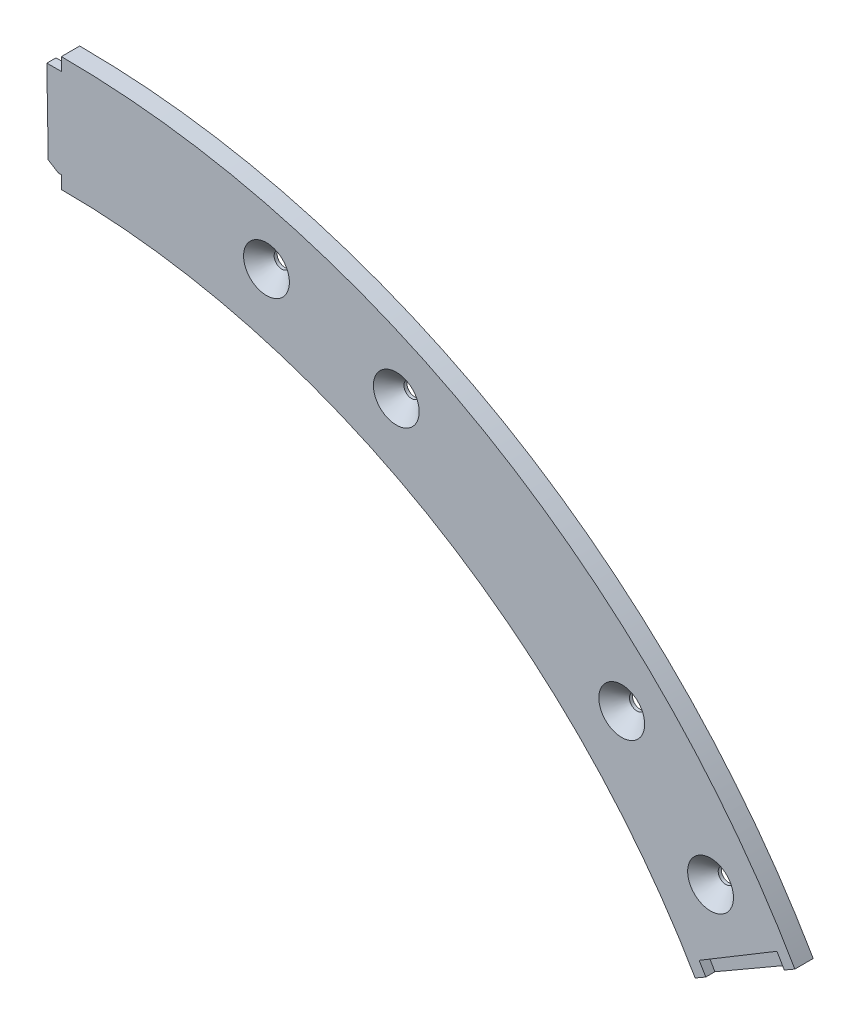
ISO-10303-21;
HEADER;
FILE_DESCRIPTION(('STEP AP214'),'2;1');
FILE_NAME('part.step','',(''),(''),'','','');
FILE_SCHEMA(('AUTOMOTIVE_DESIGN { 1 0 10303 214 1 1 1 1 }'));
ENDSEC;
DATA;
#1=APPLICATION_CONTEXT('core data for automotive mechanical design processes');
#2=APPLICATION_PROTOCOL_DEFINITION('international standard','automotive_design',2000,#1);
#3=PRODUCT_CONTEXT('',#1,'mechanical');
#4=PRODUCT('Part','Part','',(#3));
#5=PRODUCT_RELATED_PRODUCT_CATEGORY('part','',(#4));
#6=PRODUCT_DEFINITION_FORMATION('','',#4);
#7=PRODUCT_DEFINITION_CONTEXT('part definition',#1,'design');
#8=PRODUCT_DEFINITION('design','',#6,#7);
#9=PRODUCT_DEFINITION_SHAPE('','',#8);
#10=(LENGTH_UNIT() NAMED_UNIT(*) SI_UNIT(.MILLI.,.METRE.));
#11=(NAMED_UNIT(*) PLANE_ANGLE_UNIT() SI_UNIT($,.RADIAN.));
#12=(NAMED_UNIT(*) SI_UNIT($,.STERADIAN.) SOLID_ANGLE_UNIT());
#13=UNCERTAINTY_MEASURE_WITH_UNIT(LENGTH_MEASURE(1.E-05),#10,'distance_accuracy_value','');
#14=(GEOMETRIC_REPRESENTATION_CONTEXT(3) GLOBAL_UNCERTAINTY_ASSIGNED_CONTEXT((#13)) GLOBAL_UNIT_ASSIGNED_CONTEXT((#10,
#11,#12)) REPRESENTATION_CONTEXT('',''));
#15=CARTESIAN_POINT('',(0.,0.,0.));
#16=DIRECTION('',(0.,0.,1.));
#17=DIRECTION('',(1.,0.,0.));
#18=AXIS2_PLACEMENT_3D('',#15,#16,#17);
#19=CARTESIAN_POINT('',(0.,277.3,6.));
#20=DIRECTION('',(1.,0.,0.));
#21=DIRECTION('',(0.,0.,-1.));
#22=AXIS2_PLACEMENT_3D('',#19,#20,#21);
#23=PLANE('',#22);
#24=DIRECTION('',(0.,0.,1.));
#25=VECTOR('',#24,1.);
#26=CARTESIAN_POINT('',(0.,243.81,6.));
#27=LINE('',#26,#25);
#28=CARTESIAN_POINT('',(0.,243.81,3.));
#29=VERTEX_POINT('',#28);
#30=CARTESIAN_POINT('',(0.,243.81,6.));
#31=VERTEX_POINT('',#30);
#32=EDGE_CURVE('E162',#29,#31,#27,.T.);
#33=ORIENTED_EDGE('',*,*,#32,.F.);
#34=DIRECTION('',(0.,-1.,0.));
#35=VECTOR('',#34,1.);
#36=CARTESIAN_POINT('',(0.,273.1,3.));
#37=LINE('',#36,#35);
#38=CARTESIAN_POINT('',(0.,273.1,3.));
#39=VERTEX_POINT('',#38);
#40=EDGE_CURVE('E319',#39,#29,#37,.T.);
#41=ORIENTED_EDGE('',*,*,#40,.F.);
#42=DIRECTION('',(0.,0.,-1.));
#43=VECTOR('',#42,1.);
#44=CARTESIAN_POINT('',(0.,273.1,6.));
#45=LINE('',#44,#43);
#46=CARTESIAN_POINT('',(0.,273.1,6.));
#47=VERTEX_POINT('',#46);
#48=EDGE_CURVE('E323',#47,#39,#45,.T.);
#49=ORIENTED_EDGE('',*,*,#48,.F.);
#50=DIRECTION('',(0.,-1.,0.));
#51=VECTOR('',#50,1.);
#52=CARTESIAN_POINT('',(0.,277.3,6.));
#53=LINE('',#52,#51);
#54=CARTESIAN_POINT('',(0.,277.3,6.));
#55=VERTEX_POINT('',#54);
#56=EDGE_CURVE('E220',#55,#47,#53,.T.);
#57=ORIENTED_EDGE('',*,*,#56,.F.);
#58=DIRECTION('',(0.,0.,-1.));
#59=VECTOR('',#58,1.);
#60=CARTESIAN_POINT('',(0.,277.3,6.));
#61=LINE('',#60,#59);
#62=CARTESIAN_POINT('',(0.,277.3,0.));
#63=VERTEX_POINT('',#62);
#64=EDGE_CURVE('E212',#55,#63,#61,.T.);
#65=ORIENTED_EDGE('',*,*,#64,.T.);
#66=DIRECTION('',(0.,-1.,0.));
#67=VECTOR('',#66,1.);
#68=CARTESIAN_POINT('',(0.,277.3,0.));
#69=LINE('',#68,#67);
#70=CARTESIAN_POINT('',(0.,239.61,0.));
#71=VERTEX_POINT('',#70);
#72=EDGE_CURVE('E221',#63,#71,#69,.T.);
#73=ORIENTED_EDGE('',*,*,#72,.T.);
#74=DIRECTION('',(0.,0.,-1.));
#75=VECTOR('',#74,1.);
#76=CARTESIAN_POINT('',(0.,239.61,6.));
#77=LINE('',#76,#75);
#78=CARTESIAN_POINT('',(0.,239.61,6.));
#79=VERTEX_POINT('',#78);
#80=EDGE_CURVE('E216',#79,#71,#77,.T.);
#81=ORIENTED_EDGE('',*,*,#80,.F.);
#82=EDGE_CURVE('E239',#31,#79,#53,.T.);
#83=ORIENTED_EDGE('',*,*,#82,.F.);
#84=EDGE_LOOP('',(#33,#41,#49,#57,#65,#73,#81,#83));
#85=FACE_BOUND('',#84,.T.);
#86=ADVANCED_FACE('F47',(#85),#23,.F.);
#87=CARTESIAN_POINT('',(0.,0.,6.));
#88=DIRECTION('',(0.,0.,-1.));
#89=DIRECTION('',(-1.,0.,0.));
#90=AXIS2_PLACEMENT_3D('',#87,#88,#89);
#91=CYLINDRICAL_SURFACE('',#90,239.61);
#92=CARTESIAN_POINT('',(0.,0.,0.));
#93=DIRECTION('',(0.,0.,-1.));
#94=DIRECTION('',(-1.,0.,0.));
#95=AXIS2_PLACEMENT_3D('',#92,#93,#94);
#96=CIRCLE('',#95,239.61);
#97=CARTESIAN_POINT('',(207.508347000789,119.805,0.));
#98=VERTEX_POINT('',#97);
#99=EDGE_CURVE('E231',#71,#98,#96,.T.);
#100=ORIENTED_EDGE('',*,*,#99,.T.);
#101=DIRECTION('',(0.,0.,-1.));
#102=VECTOR('',#101,1.);
#103=CARTESIAN_POINT('',(207.508347000789,119.805,6.));
#104=LINE('',#103,#102);
#105=CARTESIAN_POINT('',(207.508347000789,119.805,6.));
#106=VERTEX_POINT('',#105);
#107=EDGE_CURVE('E204',#106,#98,#104,.T.);
#108=ORIENTED_EDGE('',*,*,#107,.F.);
#109=CARTESIAN_POINT('',(0.,0.,6.));
#110=DIRECTION('',(0.,0.,-1.));
#111=DIRECTION('',(-1.,0.,0.));
#112=AXIS2_PLACEMENT_3D('',#109,#110,#111);
#113=CIRCLE('',#112,239.61);
#114=EDGE_CURVE('E224',#79,#106,#113,.T.);
#115=ORIENTED_EDGE('',*,*,#114,.F.);
#116=ORIENTED_EDGE('',*,*,#80,.T.);
#117=EDGE_LOOP('',(#100,#108,#115,#116));
#118=FACE_BOUND('',#117,.T.);
#119=ADVANCED_FACE('F365',(#118),#91,.F.);
#120=CARTESIAN_POINT('',(240.148844469425,138.65,6.));
#121=DIRECTION('',(-0.499999999999999,0.866025403784439,0.));
#122=DIRECTION('',(-0.866025403784439,-0.499999999999999,0.));
#123=AXIS2_PLACEMENT_3D('',#120,#121,#122);
#124=PLANE('',#123);
#125=DIRECTION('',(0.866025403784439,0.499999999999999,0.));
#126=VECTOR('',#125,1.);
#127=CARTESIAN_POINT('',(210.972448615927,121.805,3.));
#128=LINE('',#127,#126);
#129=CARTESIAN_POINT('',(210.972448615927,121.805,3.));
#130=VERTEX_POINT('',#129);
#131=CARTESIAN_POINT('',(236.684742854287,136.65,3.));
#132=VERTEX_POINT('',#131);
#133=EDGE_CURVE('E168',#130,#132,#128,.T.);
#134=ORIENTED_EDGE('',*,*,#133,.F.);
#135=DIRECTION('',(0.,0.,-1.));
#136=VECTOR('',#135,1.);
#137=CARTESIAN_POINT('',(210.972448615927,121.805,6.));
#138=LINE('',#137,#136);
#139=CARTESIAN_POINT('',(210.972448615927,121.805,6.));
#140=VERTEX_POINT('',#139);
#141=EDGE_CURVE('E164',#140,#130,#138,.T.);
#142=ORIENTED_EDGE('',*,*,#141,.F.);
#143=DIRECTION('',(0.866025403784439,0.499999999999999,0.));
#144=VECTOR('',#143,1.);
#145=CARTESIAN_POINT('',(240.148844469425,138.65,6.));
#146=LINE('',#145,#144);
#147=EDGE_CURVE('E243',#106,#140,#146,.T.);
#148=ORIENTED_EDGE('',*,*,#147,.F.);
#149=ORIENTED_EDGE('',*,*,#107,.T.);
#150=DIRECTION('',(0.866025403784439,0.499999999999999,0.));
#151=VECTOR('',#150,1.);
#152=CARTESIAN_POINT('',(240.148844469425,138.65,0.));
#153=LINE('',#152,#151);
#154=CARTESIAN_POINT('',(240.148844469425,138.65,0.));
#155=VERTEX_POINT('',#154);
#156=EDGE_CURVE('E228',#98,#155,#153,.T.);
#157=ORIENTED_EDGE('',*,*,#156,.T.);
#158=DIRECTION('',(0.,0.,-1.));
#159=VECTOR('',#158,1.);
#160=CARTESIAN_POINT('',(240.148844469425,138.65,6.));
#161=LINE('',#160,#159);
#162=CARTESIAN_POINT('',(240.148844469425,138.65,6.));
#163=VERTEX_POINT('',#162);
#164=EDGE_CURVE('E208',#163,#155,#161,.T.);
#165=ORIENTED_EDGE('',*,*,#164,.F.);
#166=CARTESIAN_POINT('',(236.684742854287,136.65,6.));
#167=VERTEX_POINT('',#166);
#168=EDGE_CURVE('E247',#167,#163,#146,.T.);
#169=ORIENTED_EDGE('',*,*,#168,.F.);
#170=DIRECTION('',(0.,0.,1.));
#171=VECTOR('',#170,1.);
#172=CARTESIAN_POINT('',(236.684742854287,136.65,6.));
#173=LINE('',#172,#171);
#174=EDGE_CURVE('E294',#132,#167,#173,.T.);
#175=ORIENTED_EDGE('',*,*,#174,.F.);
#176=EDGE_LOOP('',(#134,#142,#148,#149,#157,#165,#169,#175));
#177=FACE_BOUND('',#176,.T.);
#178=ADVANCED_FACE('F355',(#177),#124,.F.);
#179=CARTESIAN_POINT('',(0.,0.,6.));
#180=DIRECTION('',(0.,0.,-1.));
#181=DIRECTION('',(-1.,0.,0.));
#182=AXIS2_PLACEMENT_3D('',#179,#180,#181);
#183=CYLINDRICAL_SURFACE('',#182,277.3);
#184=CARTESIAN_POINT('',(0.,0.,0.));
#185=DIRECTION('',(0.,0.,1.));
#186=DIRECTION('',(-1.,0.,0.));
#187=AXIS2_PLACEMENT_3D('',#184,#185,#186);
#188=CIRCLE('',#187,277.3);
#189=EDGE_CURVE('E225',#155,#63,#188,.T.);
#190=ORIENTED_EDGE('',*,*,#189,.T.);
#191=ORIENTED_EDGE('',*,*,#64,.F.);
#192=CARTESIAN_POINT('',(0.,0.,6.));
#193=DIRECTION('',(0.,0.,1.));
#194=DIRECTION('',(-1.,0.,0.));
#195=AXIS2_PLACEMENT_3D('',#192,#193,#194);
#196=CIRCLE('',#195,277.3);
#197=EDGE_CURVE('E240',#163,#55,#196,.T.);
#198=ORIENTED_EDGE('',*,*,#197,.F.);
#199=ORIENTED_EDGE('',*,*,#164,.T.);
#200=EDGE_LOOP('',(#190,#191,#198,#199));
#201=FACE_BOUND('',#200,.T.);
#202=ADVANCED_FACE('F358',(#201),#183,.T.);
#203=CARTESIAN_POINT('',(0.,0.,6.));
#204=DIRECTION('',(0.,0.,-1.));
#205=DIRECTION('',(-1.,0.,0.));
#206=AXIS2_PLACEMENT_3D('',#203,#204,#205);
#207=PLANE('',#206);
#208=DIRECTION('',(-0.0174524064372835,0.999847695156391,0.));
#209=VECTOR('',#208,1.);
#210=CARTESIAN_POINT('',(-4.76625219802214,273.05840554721,6.));
#211=LINE('',#210,#209);
#212=CARTESIAN_POINT('',(-4.29145190841646,245.857115173428,6.));
#213=VERTEX_POINT('',#212);
#214=CARTESIAN_POINT('',(-4.76625219802214,273.05840554721,6.));
#215=VERTEX_POINT('',#214);
#216=EDGE_CURVE('E158',#213,#215,#211,.T.);
#217=ORIENTED_EDGE('',*,*,#216,.F.);
#218=DIRECTION('',(-0.850321567496518,0.526263462393376,0.));
#219=VECTOR('',#218,1.);
#220=CARTESIAN_POINT('',(-4.29145190841646,245.857115173428,6.));
#221=LINE('',#220,#219);
#222=CARTESIAN_POINT('',(-0.980595058735524,243.808028032981,6.));
#223=VERTEX_POINT('',#222);
#224=EDGE_CURVE('E66',#223,#213,#221,.T.);
#225=ORIENTED_EDGE('',*,*,#224,.F.);
#226=CARTESIAN_POINT('',(0.,0.,6.));
#227=DIRECTION('',(0.,0.,-1.));
#228=DIRECTION('',(-1.,0.,0.));
#229=AXIS2_PLACEMENT_3D('',#226,#227,#228);
#230=CIRCLE('',#229,243.81);
#231=EDGE_CURVE('E155',#223,#31,#230,.T.);
#232=ORIENTED_EDGE('',*,*,#231,.T.);
#233=ORIENTED_EDGE('',*,*,#82,.T.);
#234=ORIENTED_EDGE('',*,*,#114,.T.);
#235=ORIENTED_EDGE('',*,*,#147,.T.);
#236=CARTESIAN_POINT('',(0.,0.,6.));
#237=DIRECTION('',(0.,0.,-1.));
#238=DIRECTION('',(-1.,0.,0.));
#239=AXIS2_PLACEMENT_3D('',#236,#237,#238);
#240=CIRCLE('',#239,243.61);
#241=CARTESIAN_POINT('',(208.814526124042,125.468425428838,6.));
#242=VERTEX_POINT('',#241);
#243=EDGE_CURVE('E276',#242,#140,#240,.T.);
#244=ORIENTED_EDGE('',*,*,#243,.F.);
#245=DIRECTION('',(-0.857167300702113,-0.515038074910053,0.));
#246=VECTOR('',#245,1.);
#247=CARTESIAN_POINT('',(208.814526124042,125.468425428838,6.));
#248=LINE('',#247,#246);
#249=CARTESIAN_POINT('',(234.263823281887,140.759905872917,6.));
#250=VERTEX_POINT('',#249);
#251=EDGE_CURVE('E279',#250,#242,#248,.T.);
#252=ORIENTED_EDGE('',*,*,#251,.F.);
#253=CARTESIAN_POINT('',(0.,0.,6.));
#254=DIRECTION('',(0.,0.,-1.));
#255=DIRECTION('',(-1.,0.,0.));
#256=AXIS2_PLACEMENT_3D('',#253,#254,#255);
#257=CIRCLE('',#256,273.3);
#258=EDGE_CURVE('E272',#250,#167,#257,.T.);
#259=ORIENTED_EDGE('',*,*,#258,.T.);
#260=ORIENTED_EDGE('',*,*,#168,.T.);
#261=ORIENTED_EDGE('',*,*,#197,.T.);
#262=ORIENTED_EDGE('',*,*,#56,.T.);
#263=CARTESIAN_POINT('',(0.,0.,6.));
#264=DIRECTION('',(0.,0.,-1.));
#265=DIRECTION('',(-1.,0.,0.));
#266=AXIS2_PLACEMENT_3D('',#263,#264,#265);
#267=CIRCLE('',#266,273.1);
#268=EDGE_CURVE('E303',#215,#47,#267,.T.);
#269=ORIENTED_EDGE('',*,*,#268,.F.);
#270=EDGE_LOOP('',(#217,#225,#232,#233,#234,#235,#244,#252,#259,#260,#261,#262,#269));
#271=FACE_BOUND('',#270,.T.);
#272=CARTESIAN_POINT('',(183.472996514473,183.472996514474,6.));
#273=DIRECTION('',(0.,0.,-1.));
#274=DIRECTION('',(-1.,0.,0.));
#275=AXIS2_PLACEMENT_3D('',#272,#273,#274);
#276=CIRCLE('',#275,7.50000000000003);
#277=CARTESIAN_POINT('',(190.972996514473,183.472996514474,6.));
#278=VERTEX_POINT('',#277);
#279=EDGE_CURVE('E184',#278,#278,#276,.T.);
#280=ORIENTED_EDGE('',*,*,#279,.T.);
#281=EDGE_LOOP('',(#280));
#282=FACE_BOUND('',#281,.T.);
#283=CARTESIAN_POINT('',(212.545380931665,148.825877940006,6.));
#284=DIRECTION('',(0.,0.,-1.));
#285=DIRECTION('',(-1.,0.,0.));
#286=AXIS2_PLACEMENT_3D('',#283,#284,#285);
#287=CIRCLE('',#286,7.50000000000003);
#288=CARTESIAN_POINT('',(220.045380931665,148.825877940006,6.));
#289=VERTEX_POINT('',#288);
#290=EDGE_CURVE('E188',#289,#289,#287,.T.);
#291=ORIENTED_EDGE('',*,*,#290,.T.);
#292=EDGE_LOOP('',(#291));
#293=FACE_BOUND('',#292,.T.);
#294=CARTESIAN_POINT('',(109.656760373859,235.1596815024,6.));
#295=DIRECTION('',(0.,0.,-1.));
#296=DIRECTION('',(-1.,0.,0.));
#297=AXIS2_PLACEMENT_3D('',#294,#295,#296);
#298=CIRCLE('',#297,7.49999999999934);
#299=CARTESIAN_POINT('',(117.156760373858,235.1596815024,6.));
#300=VERTEX_POINT('',#299);
#301=EDGE_CURVE('E192',#300,#300,#298,.T.);
#302=ORIENTED_EDGE('',*,*,#301,.T.);
#303=EDGE_LOOP('',(#302));
#304=FACE_BOUND('',#303,.T.);
#305=CARTESIAN_POINT('',(67.1557776327521,250.628774147224,6.));
#306=DIRECTION('',(0.,0.,-1.));
#307=DIRECTION('',(-1.,0.,0.));
#308=AXIS2_PLACEMENT_3D('',#305,#306,#307);
#309=CIRCLE('',#308,7.49999999999931);
#310=CARTESIAN_POINT('',(74.6557776327514,250.628774147224,6.));
#311=VERTEX_POINT('',#310);
#312=EDGE_CURVE('E196',#311,#311,#309,.T.);
#313=ORIENTED_EDGE('',*,*,#312,.T.);
#314=EDGE_LOOP('',(#313));
#315=FACE_BOUND('',#314,.T.);
#316=ADVANCED_FACE('F153',(#271,#282,#293,#304,#315),#207,.F.);
#317=CARTESIAN_POINT('',(0.,0.,0.));
#318=DIRECTION('',(0.,0.,-1.));
#319=DIRECTION('',(-1.,0.,0.));
#320=AXIS2_PLACEMENT_3D('',#317,#318,#319);
#321=PLANE('',#320);
#322=CARTESIAN_POINT('',(67.1557776327521,250.628774147224,0.));
#323=DIRECTION('',(0.,0.,1.));
#324=DIRECTION('',(1.,0.,0.));
#325=AXIS2_PLACEMENT_3D('',#322,#323,#324);
#326=CIRCLE('',#325,2.49999999999925);
#327=CARTESIAN_POINT('',(69.6557776327514,250.628774147224,0.));
#328=VERTEX_POINT('',#327);
#329=EDGE_CURVE('E235',#328,#328,#326,.T.);
#330=ORIENTED_EDGE('',*,*,#329,.T.);
#331=EDGE_LOOP('',(#330));
#332=FACE_BOUND('',#331,.T.);
#333=CARTESIAN_POINT('',(109.656760373859,235.1596815024,0.));
#334=DIRECTION('',(0.,0.,1.));
#335=DIRECTION('',(1.,0.,0.));
#336=AXIS2_PLACEMENT_3D('',#333,#334,#335);
#337=CIRCLE('',#336,2.49999999999931);
#338=CARTESIAN_POINT('',(112.156760373858,235.1596815024,0.));
#339=VERTEX_POINT('',#338);
#340=EDGE_CURVE('E260',#339,#339,#337,.T.);
#341=ORIENTED_EDGE('',*,*,#340,.T.);
#342=EDGE_LOOP('',(#341));
#343=FACE_BOUND('',#342,.T.);
#344=CARTESIAN_POINT('',(183.472996514473,183.472996514474,0.));
#345=DIRECTION('',(0.,0.,1.));
#346=DIRECTION('',(1.,0.,0.));
#347=AXIS2_PLACEMENT_3D('',#344,#345,#346);
#348=CIRCLE('',#347,2.5);
#349=CARTESIAN_POINT('',(185.972996514473,183.472996514474,0.));
#350=VERTEX_POINT('',#349);
#351=EDGE_CURVE('E255',#350,#350,#348,.T.);
#352=ORIENTED_EDGE('',*,*,#351,.T.);
#353=EDGE_LOOP('',(#352));
#354=FACE_BOUND('',#353,.T.);
#355=CARTESIAN_POINT('',(212.545380931665,148.825877940006,0.));
#356=DIRECTION('',(0.,0.,1.));
#357=DIRECTION('',(1.,0.,0.));
#358=AXIS2_PLACEMENT_3D('',#355,#356,#357);
#359=CIRCLE('',#358,2.5);
#360=CARTESIAN_POINT('',(215.045380931665,148.825877940006,0.));
#361=VERTEX_POINT('',#360);
#362=EDGE_CURVE('E251',#361,#361,#359,.T.);
#363=ORIENTED_EDGE('',*,*,#362,.T.);
#364=EDGE_LOOP('',(#363));
#365=FACE_BOUND('',#364,.T.);
#366=ORIENTED_EDGE('',*,*,#99,.F.);
#367=ORIENTED_EDGE('',*,*,#72,.F.);
#368=ORIENTED_EDGE('',*,*,#189,.F.);
#369=ORIENTED_EDGE('',*,*,#156,.F.);
#370=EDGE_LOOP('',(#366,#367,#368,#369));
#371=FACE_BOUND('',#370,.T.);
#372=ADVANCED_FACE('F362',(#332,#343,#354,#365,#371),#321,.T.);
#373=CARTESIAN_POINT('',(212.545380931665,148.825877940006,0.));
#374=DIRECTION('',(0.,0.,1.));
#375=DIRECTION('',(1.,0.,0.));
#376=AXIS2_PLACEMENT_3D('',#373,#374,#375);
#377=CYLINDRICAL_SURFACE('',#376,2.5);
#378=CARTESIAN_POINT('',(212.545380931665,148.825877940006,0.99999999999998));
#379=DIRECTION('',(0.,0.,-1.));
#380=DIRECTION('',(-1.,0.,0.));
#381=AXIS2_PLACEMENT_3D('',#378,#379,#380);
#382=CIRCLE('',#381,2.5);
#383=CARTESIAN_POINT('',(215.045380931665,148.825877940006,0.99999999999998));
#384=VERTEX_POINT('',#383);
#385=EDGE_CURVE('E180',#384,#384,#382,.F.);
#386=ORIENTED_EDGE('',*,*,#385,.T.);
#387=EDGE_LOOP('',(#386));
#388=FACE_BOUND('',#387,.T.);
#389=ORIENTED_EDGE('',*,*,#362,.F.);
#390=EDGE_LOOP('',(#389));
#391=FACE_BOUND('',#390,.T.);
#392=ADVANCED_FACE('F439',(#388,#391),#377,.F.);
#393=CARTESIAN_POINT('',(183.472996514473,183.472996514474,0.));
#394=DIRECTION('',(0.,0.,1.));
#395=DIRECTION('',(1.,0.,0.));
#396=AXIS2_PLACEMENT_3D('',#393,#394,#395);
#397=CYLINDRICAL_SURFACE('',#396,2.5);
#398=CARTESIAN_POINT('',(183.472996514473,183.472996514474,0.99999999999998));
#399=DIRECTION('',(0.,0.,-1.));
#400=DIRECTION('',(-1.,0.,0.));
#401=AXIS2_PLACEMENT_3D('',#398,#399,#400);
#402=CIRCLE('',#401,2.5);
#403=CARTESIAN_POINT('',(185.972996514473,183.472996514474,0.99999999999998));
#404=VERTEX_POINT('',#403);
#405=EDGE_CURVE('E200',#404,#404,#402,.F.);
#406=ORIENTED_EDGE('',*,*,#405,.T.);
#407=EDGE_LOOP('',(#406));
#408=FACE_BOUND('',#407,.T.);
#409=ORIENTED_EDGE('',*,*,#351,.F.);
#410=EDGE_LOOP('',(#409));
#411=FACE_BOUND('',#410,.T.);
#412=ADVANCED_FACE('F433',(#408,#411),#397,.F.);
#413=CARTESIAN_POINT('',(109.656760373859,235.1596815024,0.));
#414=DIRECTION('',(0.,0.,1.));
#415=DIRECTION('',(1.,0.,0.));
#416=AXIS2_PLACEMENT_3D('',#413,#414,#415);
#417=CYLINDRICAL_SURFACE('',#416,2.49999999999931);
#418=CARTESIAN_POINT('',(109.656760373859,235.1596815024,0.999999999999984));
#419=DIRECTION('',(0.,0.,-1.));
#420=DIRECTION('',(-1.,0.,0.));
#421=AXIS2_PLACEMENT_3D('',#418,#419,#420);
#422=CIRCLE('',#421,2.49999999999931);
#423=CARTESIAN_POINT('',(112.156760373858,235.1596815024,0.999999999999984));
#424=VERTEX_POINT('',#423);
#425=EDGE_CURVE('E176',#424,#424,#422,.F.);
#426=ORIENTED_EDGE('',*,*,#425,.T.);
#427=EDGE_LOOP('',(#426));
#428=FACE_BOUND('',#427,.T.);
#429=ORIENTED_EDGE('',*,*,#340,.F.);
#430=EDGE_LOOP('',(#429));
#431=FACE_BOUND('',#430,.T.);
#432=ADVANCED_FACE('F430',(#428,#431),#417,.F.);
#433=CARTESIAN_POINT('',(67.1557776327521,250.628774147224,0.));
#434=DIRECTION('',(0.,0.,1.));
#435=DIRECTION('',(1.,0.,0.));
#436=AXIS2_PLACEMENT_3D('',#433,#434,#435);
#437=CYLINDRICAL_SURFACE('',#436,2.49999999999925);
#438=CARTESIAN_POINT('',(67.1557776327521,250.628774147224,0.99999999999996));
#439=DIRECTION('',(0.,0.,-1.));
#440=DIRECTION('',(-1.,0.,0.));
#441=AXIS2_PLACEMENT_3D('',#438,#439,#440);
#442=CIRCLE('',#441,2.49999999999925);
#443=CARTESIAN_POINT('',(69.6557776327514,250.628774147224,0.99999999999996));
#444=VERTEX_POINT('',#443);
#445=EDGE_CURVE('E58',#444,#444,#442,.F.);
#446=ORIENTED_EDGE('',*,*,#445,.T.);
#447=EDGE_LOOP('',(#446));
#448=FACE_BOUND('',#447,.T.);
#449=ORIENTED_EDGE('',*,*,#329,.F.);
#450=EDGE_LOOP('',(#449));
#451=FACE_BOUND('',#450,.T.);
#452=ADVANCED_FACE('F410',(#448,#451),#437,.F.);
#453=CARTESIAN_POINT('',(183.472996514473,183.472996514474,0.99999999999998));
#454=DIRECTION('',(0.,0.,1.));
#455=DIRECTION('',(1.,0.,0.));
#456=AXIS2_PLACEMENT_3D('',#453,#454,#455);
#457=CONICAL_SURFACE('',#456,2.5,0.78539816339745);
#458=CARTESIAN_POINT('',(190.972996514473,183.472996514474,6.));
#459=CARTESIAN_POINT('',(190.92091318114,183.472996514474,5.94791666666667));
#460=CARTESIAN_POINT('',(190.868829847807,183.472996514474,5.89583333333333));
#461=CARTESIAN_POINT('',(190.76466318114,183.472996514474,5.79166666666667));
#462=CARTESIAN_POINT('',(190.712579847807,183.472996514474,5.73958333333333));
#463=CARTESIAN_POINT('',(190.60841318114,183.472996514474,5.63541666666666));
#464=CARTESIAN_POINT('',(190.556329847807,183.472996514474,5.58333333333333));
#465=CARTESIAN_POINT('',(190.45216318114,183.472996514474,5.47916666666666));
#466=CARTESIAN_POINT('',(190.400079847807,183.472996514474,5.42708333333333));
#467=CARTESIAN_POINT('',(190.29591318114,183.472996514474,5.32291666666667));
#468=CARTESIAN_POINT('',(190.243829847807,183.472996514474,5.27083333333333));
#469=CARTESIAN_POINT('',(190.13966318114,183.472996514474,5.16666666666666));
#470=CARTESIAN_POINT('',(190.087579847807,183.472996514474,5.11458333333333));
#471=CARTESIAN_POINT('',(189.98341318114,183.472996514474,5.01041666666666));
#472=CARTESIAN_POINT('',(189.931329847807,183.472996514474,4.95833333333333));
#473=CARTESIAN_POINT('',(189.82716318114,183.472996514474,4.85416666666666));
#474=CARTESIAN_POINT('',(189.775079847807,183.472996514474,4.80208333333333));
#475=CARTESIAN_POINT('',(189.67091318114,183.472996514474,4.69791666666666));
#476=CARTESIAN_POINT('',(189.618829847807,183.472996514474,4.64583333333333));
#477=CARTESIAN_POINT('',(189.51466318114,183.472996514474,4.54166666666666));
#478=CARTESIAN_POINT('',(189.462579847807,183.472996514474,4.48958333333333));
#479=CARTESIAN_POINT('',(189.35841318114,183.472996514474,4.38541666666666));
#480=CARTESIAN_POINT('',(189.306329847807,183.472996514474,4.33333333333333));
#481=CARTESIAN_POINT('',(189.20216318114,183.472996514474,4.22916666666666));
#482=CARTESIAN_POINT('',(189.150079847807,183.472996514474,4.17708333333333));
#483=CARTESIAN_POINT('',(189.04591318114,183.472996514474,4.07291666666666));
#484=CARTESIAN_POINT('',(188.993829847807,183.472996514474,4.02083333333333));
#485=CARTESIAN_POINT('',(188.88966318114,183.472996514474,3.91666666666666));
#486=CARTESIAN_POINT('',(188.837579847807,183.472996514474,3.86458333333333));
#487=CARTESIAN_POINT('',(188.73341318114,183.472996514474,3.76041666666666));
#488=CARTESIAN_POINT('',(188.681329847807,183.472996514474,3.70833333333332));
#489=CARTESIAN_POINT('',(188.57716318114,183.472996514474,3.60416666666666));
#490=CARTESIAN_POINT('',(188.525079847807,183.472996514474,3.55208333333333));
#491=CARTESIAN_POINT('',(188.42091318114,183.472996514474,3.44791666666666));
#492=CARTESIAN_POINT('',(188.368829847807,183.472996514474,3.39583333333332));
#493=CARTESIAN_POINT('',(188.26466318114,183.472996514474,3.29166666666666));
#494=CARTESIAN_POINT('',(188.212579847807,183.472996514474,3.23958333333332));
#495=CARTESIAN_POINT('',(188.10841318114,183.472996514474,3.13541666666666));
#496=CARTESIAN_POINT('',(188.056329847807,183.472996514474,3.08333333333332));
#497=CARTESIAN_POINT('',(187.95216318114,183.472996514474,2.97916666666665));
#498=CARTESIAN_POINT('',(187.900079847807,183.472996514474,2.92708333333332));
#499=CARTESIAN_POINT('',(187.79591318114,183.472996514474,2.82291666666665));
#500=CARTESIAN_POINT('',(187.743829847807,183.472996514474,2.77083333333332));
#501=CARTESIAN_POINT('',(187.63966318114,183.472996514474,2.66666666666665));
#502=CARTESIAN_POINT('',(187.587579847807,183.472996514474,2.61458333333332));
#503=CARTESIAN_POINT('',(187.48341318114,183.472996514474,2.51041666666666));
#504=CARTESIAN_POINT('',(187.431329847807,183.472996514474,2.45833333333332));
#505=CARTESIAN_POINT('',(187.32716318114,183.472996514474,2.35416666666665));
#506=CARTESIAN_POINT('',(187.275079847807,183.472996514474,2.30208333333332));
#507=CARTESIAN_POINT('',(187.17091318114,183.472996514474,2.19791666666665));
#508=CARTESIAN_POINT('',(187.118829847807,183.472996514474,2.14583333333332));
#509=CARTESIAN_POINT('',(187.01466318114,183.472996514474,2.04166666666665));
#510=CARTESIAN_POINT('',(186.962579847807,183.472996514474,1.98958333333332));
#511=CARTESIAN_POINT('',(186.85841318114,183.472996514474,1.88541666666665));
#512=CARTESIAN_POINT('',(186.806329847807,183.472996514474,1.83333333333331));
#513=CARTESIAN_POINT('',(186.70216318114,183.472996514474,1.72916666666665));
#514=CARTESIAN_POINT('',(186.650079847807,183.472996514474,1.67708333333332));
#515=CARTESIAN_POINT('',(186.54591318114,183.472996514474,1.57291666666665));
#516=CARTESIAN_POINT('',(186.493829847807,183.472996514474,1.52083333333332));
#517=CARTESIAN_POINT('',(186.38966318114,183.472996514474,1.41666666666665));
#518=CARTESIAN_POINT('',(186.337579847807,183.472996514474,1.36458333333331));
#519=CARTESIAN_POINT('',(186.23341318114,183.472996514474,1.26041666666665));
#520=CARTESIAN_POINT('',(186.181329847807,183.472996514474,1.20833333333331));
#521=CARTESIAN_POINT('',(186.07716318114,183.472996514474,1.10416666666665));
#522=CARTESIAN_POINT('',(186.025079847807,183.472996514474,1.05208333333331));
#523=CARTESIAN_POINT('',(185.972996514473,183.472996514474,0.99999999999998));
#524=B_SPLINE_CURVE_WITH_KNOTS('',3,(#458,#459,#460,#461,#462,#463,#464,#465,#466,#467,#468,
#469,#470,#471,#472,#473,#474,#475,#476,#477,#478,#479,#480,#481,#482,#483,#484,#485,#486,#487,
#488,#489,#490,#491,#492,#493,#494,#495,#496,#497,#498,#499,#500,#501,#502,#503,#504,#505,#506,
#507,#508,#509,#510,#511,#512,#513,#514,#515,#516,#517,#518,#519,#520,#521,#522,#523),
.UNSPECIFIED.,.F.,.F.,(4,2,2,2,2,2,2,2,2,2,2,2,2,2,2,2,2,2,2,2,2,2,2,2,2,2,2,2,2,2,2,2,4),(0.,
0.220970869120794,0.441941738241588,0.662912607362383,0.883883476483196,1.10485434560399,
1.32582521472478,1.54679608384558,1.76776695296637,1.98873782208717,2.20970869120798,
2.43067956032878,2.65165042944957,2.87262129857036,3.09359216769116,3.31456303681195,
3.53553390593277,3.75650477505356,3.97747564417435,4.19844651329515,4.41941738241594,
4.64038825153674,4.86135912065755,5.08232998977835,5.30330085889914,5.52427172801993,
5.74524259714073,5.96621346626152,6.18718433538234,6.40815520450313,6.62912607362393,
6.85009694274472,7.07106781186551),.UNSPECIFIED.);
#525=EDGE_CURVE('BSEAM403',#278,#404,#524,.T.);
#526=ORIENTED_EDGE('',*,*,#279,.F.);
#527=ORIENTED_EDGE('',*,*,#405,.F.);
#528=ORIENTED_EDGE('',*,*,#525,.T.);
#529=ORIENTED_EDGE('',*,*,#525,.F.);
#530=EDGE_LOOP('',(#526,#528,#527,#529));
#531=FACE_BOUND('',#530,.T.);
#532=ADVANCED_FACE('F403',(#531),#457,.F.);
#533=CARTESIAN_POINT('',(212.545380931665,148.825877940006,0.99999999999998));
#534=DIRECTION('',(0.,0.,1.));
#535=DIRECTION('',(1.,0.,0.));
#536=AXIS2_PLACEMENT_3D('',#533,#534,#535);
#537=CONICAL_SURFACE('',#536,2.5,0.78539816339745);
#538=CARTESIAN_POINT('',(220.045380931665,148.825877940006,6.));
#539=CARTESIAN_POINT('',(219.993297598331,148.825877940006,5.94791666666667));
#540=CARTESIAN_POINT('',(219.941214264998,148.825877940006,5.89583333333333));
#541=CARTESIAN_POINT('',(219.837047598331,148.825877940006,5.79166666666666));
#542=CARTESIAN_POINT('',(219.784964264998,148.825877940006,5.73958333333333));
#543=CARTESIAN_POINT('',(219.680797598331,148.825877940006,5.63541666666666));
#544=CARTESIAN_POINT('',(219.628714264998,148.825877940006,5.58333333333333));
#545=CARTESIAN_POINT('',(219.524547598331,148.825877940006,5.47916666666667));
#546=CARTESIAN_POINT('',(219.472464264998,148.825877940006,5.42708333333333));
#547=CARTESIAN_POINT('',(219.368297598331,148.825877940006,5.32291666666666));
#548=CARTESIAN_POINT('',(219.316214264998,148.825877940006,5.27083333333333));
#549=CARTESIAN_POINT('',(219.212047598331,148.825877940006,5.16666666666666));
#550=CARTESIAN_POINT('',(219.159964264998,148.825877940006,5.11458333333333));
#551=CARTESIAN_POINT('',(219.055797598331,148.825877940006,5.01041666666666));
#552=CARTESIAN_POINT('',(219.003714264998,148.825877940006,4.95833333333333));
#553=CARTESIAN_POINT('',(218.899547598331,148.825877940006,4.85416666666666));
#554=CARTESIAN_POINT('',(218.847464264998,148.825877940006,4.80208333333333));
#555=CARTESIAN_POINT('',(218.743297598331,148.825877940006,4.69791666666666));
#556=CARTESIAN_POINT('',(218.691214264998,148.825877940006,4.64583333333333));
#557=CARTESIAN_POINT('',(218.587047598331,148.825877940006,4.54166666666666));
#558=CARTESIAN_POINT('',(218.534964264998,148.825877940006,4.48958333333333));
#559=CARTESIAN_POINT('',(218.430797598331,148.825877940006,4.38541666666666));
#560=CARTESIAN_POINT('',(218.378714264998,148.825877940006,4.33333333333333));
#561=CARTESIAN_POINT('',(218.274547598331,148.825877940006,4.22916666666666));
#562=CARTESIAN_POINT('',(218.222464264998,148.825877940006,4.17708333333333));
#563=CARTESIAN_POINT('',(218.118297598331,148.825877940006,4.07291666666666));
#564=CARTESIAN_POINT('',(218.066214264998,148.825877940006,4.02083333333333));
#565=CARTESIAN_POINT('',(217.962047598331,148.825877940006,3.91666666666666));
#566=CARTESIAN_POINT('',(217.909964264998,148.825877940006,3.86458333333333));
#567=CARTESIAN_POINT('',(217.805797598331,148.825877940006,3.76041666666666));
#568=CARTESIAN_POINT('',(217.753714264998,148.825877940006,3.70833333333332));
#569=CARTESIAN_POINT('',(217.649547598331,148.825877940006,3.60416666666666));
#570=CARTESIAN_POINT('',(217.597464264998,148.825877940006,3.55208333333333));
#571=CARTESIAN_POINT('',(217.493297598331,148.825877940006,3.44791666666666));
#572=CARTESIAN_POINT('',(217.441214264998,148.825877940006,3.39583333333332));
#573=CARTESIAN_POINT('',(217.337047598331,148.825877940006,3.29166666666666));
#574=CARTESIAN_POINT('',(217.284964264998,148.825877940006,3.23958333333332));
#575=CARTESIAN_POINT('',(217.180797598331,148.825877940006,3.13541666666666));
#576=CARTESIAN_POINT('',(217.128714264998,148.825877940006,3.08333333333332));
#577=CARTESIAN_POINT('',(217.024547598331,148.825877940006,2.97916666666665));
#578=CARTESIAN_POINT('',(216.972464264998,148.825877940006,2.92708333333332));
#579=CARTESIAN_POINT('',(216.868297598331,148.825877940006,2.82291666666665));
#580=CARTESIAN_POINT('',(216.816214264998,148.825877940006,2.77083333333332));
#581=CARTESIAN_POINT('',(216.712047598331,148.825877940006,2.66666666666665));
#582=CARTESIAN_POINT('',(216.659964264998,148.825877940006,2.61458333333332));
#583=CARTESIAN_POINT('',(216.555797598331,148.825877940006,2.51041666666666));
#584=CARTESIAN_POINT('',(216.503714264998,148.825877940006,2.45833333333332));
#585=CARTESIAN_POINT('',(216.399547598331,148.825877940006,2.35416666666665));
#586=CARTESIAN_POINT('',(216.347464264998,148.825877940006,2.30208333333332));
#587=CARTESIAN_POINT('',(216.243297598331,148.825877940006,2.19791666666665));
#588=CARTESIAN_POINT('',(216.191214264998,148.825877940006,2.14583333333332));
#589=CARTESIAN_POINT('',(216.087047598331,148.825877940006,2.04166666666665));
#590=CARTESIAN_POINT('',(216.034964264998,148.825877940006,1.98958333333332));
#591=CARTESIAN_POINT('',(215.930797598331,148.825877940006,1.88541666666665));
#592=CARTESIAN_POINT('',(215.878714264998,148.825877940006,1.83333333333331));
#593=CARTESIAN_POINT('',(215.774547598331,148.825877940006,1.72916666666665));
#594=CARTESIAN_POINT('',(215.722464264998,148.825877940006,1.67708333333332));
#595=CARTESIAN_POINT('',(215.618297598331,148.825877940006,1.57291666666665));
#596=CARTESIAN_POINT('',(215.566214264998,148.825877940006,1.52083333333332));
#597=CARTESIAN_POINT('',(215.462047598331,148.825877940006,1.41666666666665));
#598=CARTESIAN_POINT('',(215.409964264998,148.825877940006,1.36458333333331));
#599=CARTESIAN_POINT('',(215.305797598331,148.825877940006,1.26041666666665));
#600=CARTESIAN_POINT('',(215.253714264998,148.825877940006,1.20833333333331));
#601=CARTESIAN_POINT('',(215.149547598331,148.825877940006,1.10416666666665));
#602=CARTESIAN_POINT('',(215.097464264998,148.825877940006,1.05208333333331));
#603=CARTESIAN_POINT('',(215.045380931665,148.825877940006,0.99999999999998));
#604=B_SPLINE_CURVE_WITH_KNOTS('',3,(#538,#539,#540,#541,#542,#543,#544,#545,#546,#547,#548,
#549,#550,#551,#552,#553,#554,#555,#556,#557,#558,#559,#560,#561,#562,#563,#564,#565,#566,#567,
#568,#569,#570,#571,#572,#573,#574,#575,#576,#577,#578,#579,#580,#581,#582,#583,#584,#585,#586,
#587,#588,#589,#590,#591,#592,#593,#594,#595,#596,#597,#598,#599,#600,#601,#602,#603),
.UNSPECIFIED.,.F.,.F.,(4,2,2,2,2,2,2,2,2,2,2,2,2,2,2,2,2,2,2,2,2,2,2,2,2,2,2,2,2,2,2,2,4),(0.,
0.220970869120794,0.441941738241588,0.662912607362402,0.883883476483196,1.10485434560399,
1.32582521472478,1.54679608384558,1.76776695296637,1.98873782208717,2.20970869120798,
2.43067956032878,2.65165042944957,2.87262129857036,3.09359216769116,3.31456303681195,
3.53553390593277,3.75650477505356,3.97747564417435,4.19844651329515,4.41941738241594,
4.64038825153674,4.86135912065755,5.08232998977835,5.30330085889914,5.52427172801993,
5.74524259714073,5.96621346626152,6.18718433538234,6.40815520450313,6.62912607362393,
6.85009694274472,7.07106781186551),.UNSPECIFIED.);
#605=EDGE_CURVE('BSEAM409',#289,#384,#604,.T.);
#606=ORIENTED_EDGE('',*,*,#290,.F.);
#607=ORIENTED_EDGE('',*,*,#385,.F.);
#608=ORIENTED_EDGE('',*,*,#605,.T.);
#609=ORIENTED_EDGE('',*,*,#605,.F.);
#610=EDGE_LOOP('',(#606,#608,#607,#609));
#611=FACE_BOUND('',#610,.T.);
#612=ADVANCED_FACE('F409',(#611),#537,.F.);
#613=CARTESIAN_POINT('',(109.656760373859,235.1596815024,0.999999999999984));
#614=DIRECTION('',(0.,0.,1.));
#615=DIRECTION('',(1.,0.,0.));
#616=AXIS2_PLACEMENT_3D('',#613,#614,#615);
#617=CONICAL_SURFACE('',#616,2.49999999999931,0.78539816339745);
#618=CARTESIAN_POINT('',(117.156760373858,235.1596815024,6.));
#619=CARTESIAN_POINT('',(117.104677040525,235.1596815024,5.94791666666666));
#620=CARTESIAN_POINT('',(117.052593707191,235.1596815024,5.89583333333333));
#621=CARTESIAN_POINT('',(116.948427040525,235.1596815024,5.79166666666667));
#622=CARTESIAN_POINT('',(116.896343707191,235.1596815024,5.73958333333333));
#623=CARTESIAN_POINT('',(116.792177040525,235.1596815024,5.63541666666667));
#624=CARTESIAN_POINT('',(116.740093707191,235.1596815024,5.58333333333333));
#625=CARTESIAN_POINT('',(116.635927040525,235.1596815024,5.47916666666666));
#626=CARTESIAN_POINT('',(116.583843707191,235.1596815024,5.42708333333333));
#627=CARTESIAN_POINT('',(116.479677040525,235.1596815024,5.32291666666666));
#628=CARTESIAN_POINT('',(116.427593707191,235.1596815024,5.27083333333333));
#629=CARTESIAN_POINT('',(116.323427040525,235.1596815024,5.16666666666667));
#630=CARTESIAN_POINT('',(116.271343707191,235.1596815024,5.11458333333333));
#631=CARTESIAN_POINT('',(116.167177040525,235.1596815024,5.01041666666666));
#632=CARTESIAN_POINT('',(116.115093707191,235.1596815024,4.95833333333333));
#633=CARTESIAN_POINT('',(116.010927040525,235.1596815024,4.85416666666666));
#634=CARTESIAN_POINT('',(115.958843707191,235.1596815024,4.80208333333333));
#635=CARTESIAN_POINT('',(115.854677040525,235.1596815024,4.69791666666666));
#636=CARTESIAN_POINT('',(115.802593707191,235.1596815024,4.64583333333333));
#637=CARTESIAN_POINT('',(115.698427040525,235.1596815024,4.54166666666666));
#638=CARTESIAN_POINT('',(115.646343707191,235.1596815024,4.48958333333333));
#639=CARTESIAN_POINT('',(115.542177040525,235.1596815024,4.38541666666666));
#640=CARTESIAN_POINT('',(115.490093707191,235.1596815024,4.33333333333333));
#641=CARTESIAN_POINT('',(115.385927040525,235.1596815024,4.22916666666666));
#642=CARTESIAN_POINT('',(115.333843707191,235.1596815024,4.17708333333333));
#643=CARTESIAN_POINT('',(115.229677040525,235.1596815024,4.07291666666666));
#644=CARTESIAN_POINT('',(115.177593707191,235.1596815024,4.02083333333333));
#645=CARTESIAN_POINT('',(115.073427040525,235.1596815024,3.91666666666666));
#646=CARTESIAN_POINT('',(115.021343707191,235.1596815024,3.86458333333333));
#647=CARTESIAN_POINT('',(114.917177040525,235.1596815024,3.76041666666666));
#648=CARTESIAN_POINT('',(114.865093707191,235.1596815024,3.70833333333333));
#649=CARTESIAN_POINT('',(114.760927040525,235.1596815024,3.60416666666666));
#650=CARTESIAN_POINT('',(114.708843707191,235.1596815024,3.55208333333332));
#651=CARTESIAN_POINT('',(114.604677040525,235.1596815024,3.44791666666666));
#652=CARTESIAN_POINT('',(114.552593707191,235.1596815024,3.39583333333333));
#653=CARTESIAN_POINT('',(114.448427040525,235.1596815024,3.29166666666666));
#654=CARTESIAN_POINT('',(114.396343707191,235.1596815024,3.23958333333332));
#655=CARTESIAN_POINT('',(114.292177040525,235.1596815024,3.13541666666666));
#656=CARTESIAN_POINT('',(114.240093707191,235.1596815024,3.08333333333332));
#657=CARTESIAN_POINT('',(114.135927040525,235.1596815024,2.97916666666666));
#658=CARTESIAN_POINT('',(114.083843707191,235.1596815024,2.92708333333332));
#659=CARTESIAN_POINT('',(113.979677040525,235.1596815024,2.82291666666666));
#660=CARTESIAN_POINT('',(113.927593707191,235.1596815024,2.77083333333332));
#661=CARTESIAN_POINT('',(113.823427040525,235.1596815024,2.66666666666666));
#662=CARTESIAN_POINT('',(113.771343707191,235.1596815024,2.61458333333332));
#663=CARTESIAN_POINT('',(113.667177040525,235.1596815024,2.51041666666665));
#664=CARTESIAN_POINT('',(113.615093707191,235.1596815024,2.45833333333332));
#665=CARTESIAN_POINT('',(113.510927040525,235.1596815024,2.35416666666665));
#666=CARTESIAN_POINT('',(113.458843707191,235.1596815024,2.30208333333332));
#667=CARTESIAN_POINT('',(113.354677040525,235.1596815024,2.19791666666666));
#668=CARTESIAN_POINT('',(113.302593707191,235.1596815024,2.14583333333332));
#669=CARTESIAN_POINT('',(113.198427040525,235.1596815024,2.04166666666665));
#670=CARTESIAN_POINT('',(113.146343707191,235.1596815024,1.98958333333332));
#671=CARTESIAN_POINT('',(113.042177040525,235.1596815024,1.88541666666665));
#672=CARTESIAN_POINT('',(112.990093707191,235.1596815024,1.83333333333332));
#673=CARTESIAN_POINT('',(112.885927040525,235.1596815024,1.72916666666665));
#674=CARTESIAN_POINT('',(112.833843707191,235.1596815024,1.67708333333332));
#675=CARTESIAN_POINT('',(112.729677040525,235.1596815024,1.57291666666665));
#676=CARTESIAN_POINT('',(112.677593707191,235.1596815024,1.52083333333332));
#677=CARTESIAN_POINT('',(112.573427040525,235.1596815024,1.41666666666665));
#678=CARTESIAN_POINT('',(112.521343707191,235.1596815024,1.36458333333332));
#679=CARTESIAN_POINT('',(112.417177040525,235.1596815024,1.26041666666665));
#680=CARTESIAN_POINT('',(112.365093707191,235.1596815024,1.20833333333332));
#681=CARTESIAN_POINT('',(112.260927040525,235.1596815024,1.10416666666665));
#682=CARTESIAN_POINT('',(112.208843707191,235.1596815024,1.05208333333332));
#683=CARTESIAN_POINT('',(112.156760373858,235.1596815024,0.999999999999984));
#684=B_SPLINE_CURVE_WITH_KNOTS('',3,(#618,#619,#620,#621,#622,#623,#624,#625,#626,#627,#628,
#629,#630,#631,#632,#633,#634,#635,#636,#637,#638,#639,#640,#641,#642,#643,#644,#645,#646,#647,
#648,#649,#650,#651,#652,#653,#654,#655,#656,#657,#658,#659,#660,#661,#662,#663,#664,#665,#666,
#667,#668,#669,#670,#671,#672,#673,#674,#675,#676,#677,#678,#679,#680,#681,#682,#683),
.UNSPECIFIED.,.F.,.F.,(4,2,2,2,2,2,2,2,2,2,2,2,2,2,2,2,2,2,2,2,2,2,2,2,2,2,2,2,2,2,2,2,4),(0.,
0.220970869120794,0.441941738241598,0.662912607362392,0.883883476483186,1.10485434560399,
1.32582521472478,1.54679608384558,1.76776695296638,1.98873782208718,2.20970869120797,
2.43067956032877,2.65165042944957,2.87262129857036,3.09359216769116,3.31456303681196,
3.53553390593276,3.75650477505356,3.97747564417435,4.19844651329515,4.41941738241594,
4.64038825153675,4.86135912065754,5.08232998977834,5.30330085889914,5.52427172801993,
5.74524259714073,5.96621346626153,6.18718433538233,6.40815520450312,6.62912607362392,
6.85009694274472,7.07106781186551),.UNSPECIFIED.);
#685=EDGE_CURVE('BSEAM416',#300,#424,#684,.T.);
#686=ORIENTED_EDGE('',*,*,#301,.F.);
#687=ORIENTED_EDGE('',*,*,#425,.F.);
#688=ORIENTED_EDGE('',*,*,#685,.T.);
#689=ORIENTED_EDGE('',*,*,#685,.F.);
#690=EDGE_LOOP('',(#686,#688,#687,#689));
#691=FACE_BOUND('',#690,.T.);
#692=ADVANCED_FACE('F416',(#691),#617,.F.);
#693=CARTESIAN_POINT('',(67.1557776327521,250.628774147224,0.99999999999996));
#694=DIRECTION('',(0.,0.,1.));
#695=DIRECTION('',(1.,0.,0.));
#696=AXIS2_PLACEMENT_3D('',#693,#694,#695);
#697=CONICAL_SURFACE('',#696,2.49999999999925,0.78539816339745);
#698=CARTESIAN_POINT('',(74.6557776327514,250.628774147224,6.));
#699=CARTESIAN_POINT('',(74.6036942994181,250.628774147224,5.94791666666666));
#700=CARTESIAN_POINT('',(74.5516109660848,250.628774147224,5.89583333333333));
#701=CARTESIAN_POINT('',(74.4474442994181,250.628774147224,5.79166666666667));
#702=CARTESIAN_POINT('',(74.3953609660848,250.628774147224,5.73958333333333));
#703=CARTESIAN_POINT('',(74.2911942994181,250.628774147224,5.63541666666667));
#704=CARTESIAN_POINT('',(74.2391109660847,250.628774147224,5.58333333333333));
#705=CARTESIAN_POINT('',(74.1349442994181,250.628774147224,5.47916666666666));
#706=CARTESIAN_POINT('',(74.0828609660847,250.628774147224,5.42708333333333));
#707=CARTESIAN_POINT('',(73.9786942994181,250.628774147224,5.32291666666666));
#708=CARTESIAN_POINT('',(73.9266109660847,250.628774147224,5.27083333333333));
#709=CARTESIAN_POINT('',(73.8224442994181,250.628774147224,5.16666666666666));
#710=CARTESIAN_POINT('',(73.7703609660847,250.628774147224,5.11458333333333));
#711=CARTESIAN_POINT('',(73.6661942994181,250.628774147224,5.01041666666666));
#712=CARTESIAN_POINT('',(73.6141109660847,250.628774147224,4.95833333333333));
#713=CARTESIAN_POINT('',(73.5099442994181,250.628774147224,4.85416666666666));
#714=CARTESIAN_POINT('',(73.4578609660847,250.628774147224,4.80208333333333));
#715=CARTESIAN_POINT('',(73.3536942994181,250.628774147224,4.69791666666666));
#716=CARTESIAN_POINT('',(73.3016109660847,250.628774147224,4.64583333333332));
#717=CARTESIAN_POINT('',(73.1974442994181,250.628774147224,4.54166666666665));
#718=CARTESIAN_POINT('',(73.1453609660847,250.628774147224,4.48958333333332));
#719=CARTESIAN_POINT('',(73.0411942994181,250.628774147224,4.38541666666666));
#720=CARTESIAN_POINT('',(72.9891109660847,250.628774147224,4.33333333333332));
#721=CARTESIAN_POINT('',(72.8849442994181,250.628774147224,4.22916666666665));
#722=CARTESIAN_POINT('',(72.8328609660847,250.628774147224,4.17708333333332));
#723=CARTESIAN_POINT('',(72.7286942994181,250.628774147224,4.07291666666665));
#724=CARTESIAN_POINT('',(72.6766109660847,250.628774147224,4.02083333333332));
#725=CARTESIAN_POINT('',(72.5724442994181,250.628774147224,3.91666666666665));
#726=CARTESIAN_POINT('',(72.5203609660847,250.628774147224,3.86458333333332));
#727=CARTESIAN_POINT('',(72.4161942994181,250.628774147224,3.76041666666665));
#728=CARTESIAN_POINT('',(72.3641109660847,250.628774147224,3.70833333333332));
#729=CARTESIAN_POINT('',(72.2599442994181,250.628774147224,3.60416666666665));
#730=CARTESIAN_POINT('',(72.2078609660847,250.628774147224,3.55208333333332));
#731=CARTESIAN_POINT('',(72.1036942994181,250.628774147224,3.44791666666665));
#732=CARTESIAN_POINT('',(72.0516109660847,250.628774147224,3.39583333333331));
#733=CARTESIAN_POINT('',(71.9474442994181,250.628774147224,3.29166666666664));
#734=CARTESIAN_POINT('',(71.8953609660847,250.628774147224,3.23958333333331));
#735=CARTESIAN_POINT('',(71.7911942994181,250.628774147224,3.13541666666665));
#736=CARTESIAN_POINT('',(71.7391109660847,250.628774147224,3.08333333333331));
#737=CARTESIAN_POINT('',(71.6349442994181,250.628774147224,2.97916666666664));
#738=CARTESIAN_POINT('',(71.5828609660847,250.628774147224,2.92708333333331));
#739=CARTESIAN_POINT('',(71.478694299418,250.628774147224,2.82291666666664));
#740=CARTESIAN_POINT('',(71.4266109660847,250.628774147224,2.77083333333331));
#741=CARTESIAN_POINT('',(71.322444299418,250.628774147224,2.66666666666664));
#742=CARTESIAN_POINT('',(71.2703609660847,250.628774147224,2.61458333333331));
#743=CARTESIAN_POINT('',(71.166194299418,250.628774147224,2.51041666666664));
#744=CARTESIAN_POINT('',(71.1141109660847,250.628774147224,2.45833333333331));
#745=CARTESIAN_POINT('',(71.009944299418,250.628774147224,2.35416666666664));
#746=CARTESIAN_POINT('',(70.9578609660847,250.628774147224,2.30208333333331));
#747=CARTESIAN_POINT('',(70.853694299418,250.628774147224,2.19791666666664));
#748=CARTESIAN_POINT('',(70.8016109660847,250.628774147224,2.1458333333333));
#749=CARTESIAN_POINT('',(70.697444299418,250.628774147224,2.04166666666663));
#750=CARTESIAN_POINT('',(70.6453609660847,250.628774147224,1.9895833333333));
#751=CARTESIAN_POINT('',(70.541194299418,250.628774147224,1.88541666666664));
#752=CARTESIAN_POINT('',(70.4891109660847,250.628774147224,1.8333333333333));
#753=CARTESIAN_POINT('',(70.384944299418,250.628774147224,1.72916666666663));
#754=CARTESIAN_POINT('',(70.3328609660847,250.628774147224,1.6770833333333));
#755=CARTESIAN_POINT('',(70.228694299418,250.628774147224,1.57291666666663));
#756=CARTESIAN_POINT('',(70.1766109660847,250.628774147224,1.5208333333333));
#757=CARTESIAN_POINT('',(70.072444299418,250.628774147224,1.41666666666663));
#758=CARTESIAN_POINT('',(70.0203609660847,250.628774147224,1.3645833333333));
#759=CARTESIAN_POINT('',(69.916194299418,250.628774147224,1.26041666666663));
#760=CARTESIAN_POINT('',(69.8641109660847,250.628774147224,1.2083333333333));
#761=CARTESIAN_POINT('',(69.759944299418,250.628774147224,1.10416666666663));
#762=CARTESIAN_POINT('',(69.7078609660847,250.628774147224,1.0520833333333));
#763=CARTESIAN_POINT('',(69.6557776327514,250.628774147224,0.99999999999996));
#764=B_SPLINE_CURVE_WITH_KNOTS('',3,(#698,#699,#700,#701,#702,#703,#704,#705,#706,#707,#708,
#709,#710,#711,#712,#713,#714,#715,#716,#717,#718,#719,#720,#721,#722,#723,#724,#725,#726,#727,
#728,#729,#730,#731,#732,#733,#734,#735,#736,#737,#738,#739,#740,#741,#742,#743,#744,#745,#746,
#747,#748,#749,#750,#751,#752,#753,#754,#755,#756,#757,#758,#759,#760,#761,#762,#763),
.UNSPECIFIED.,.F.,.F.,(4,2,2,2,2,2,2,2,2,2,2,2,2,2,2,2,2,2,2,2,2,2,2,2,2,2,2,2,2,2,2,2,4),(0.,
0.220970869120794,0.441941738241599,0.662912607362394,0.883883476483198,1.10485434560399,
1.32582521472479,1.54679608384559,1.76776695296639,1.98873782208718,2.20970869120799,
2.43067956032878,2.65165042944958,2.87262129857038,3.09359216769117,3.31456303681198,
3.53553390593277,3.75650477505357,3.97747564417437,4.19844651329517,4.41941738241596,
4.64038825153677,4.86135912065756,5.08232998977837,5.30330085889916,5.52427172801995,
5.74524259714076,5.96621346626155,6.18718433538235,6.40815520450315,6.62912607362395,
6.85009694274475,7.07106781186555),.UNSPECIFIED.);
#765=EDGE_CURVE('BSEAM50',#311,#444,#764,.T.);
#766=ORIENTED_EDGE('',*,*,#312,.F.);
#767=ORIENTED_EDGE('',*,*,#445,.F.);
#768=ORIENTED_EDGE('',*,*,#765,.T.);
#769=ORIENTED_EDGE('',*,*,#765,.F.);
#770=EDGE_LOOP('',(#766,#768,#767,#769));
#771=FACE_BOUND('',#770,.T.);
#772=ADVANCED_FACE('F50',(#771),#697,.F.);
#773=CARTESIAN_POINT('',(0.,0.,0.));
#774=DIRECTION('',(0.,0.,-1.));
#775=DIRECTION('',(-1.,0.,0.));
#776=AXIS2_PLACEMENT_3D('',#773,#774,#775);
#777=CYLINDRICAL_SURFACE('',#776,243.61);
#778=CARTESIAN_POINT('',(0.,0.,3.));
#779=DIRECTION('',(0.,0.,-1.));
#780=DIRECTION('',(-1.,0.,0.));
#781=AXIS2_PLACEMENT_3D('',#778,#779,#780);
#782=CIRCLE('',#781,243.61);
#783=CARTESIAN_POINT('',(208.814526124042,125.468425428838,3.));
#784=VERTEX_POINT('',#783);
#785=EDGE_CURVE('E256',#784,#130,#782,.T.);
#786=ORIENTED_EDGE('',*,*,#785,.F.);
#787=DIRECTION('',(0.,0.,-1.));
#788=VECTOR('',#787,1.);
#789=CARTESIAN_POINT('',(208.814526124042,125.468425428838,6.));
#790=LINE('',#789,#788);
#791=EDGE_CURVE('E290',#242,#784,#790,.T.);
#792=ORIENTED_EDGE('',*,*,#791,.F.);
#793=ORIENTED_EDGE('',*,*,#243,.T.);
#794=ORIENTED_EDGE('',*,*,#141,.T.);
#795=EDGE_LOOP('',(#786,#792,#793,#794));
#796=FACE_BOUND('',#795,.T.);
#797=ADVANCED_FACE('F369',(#796),#777,.T.);
#798=CARTESIAN_POINT('',(208.814526124042,125.468425428838,3.));
#799=DIRECTION('',(0.,0.,-1.));
#800=DIRECTION('',(-1.,0.,0.));
#801=AXIS2_PLACEMENT_3D('',#798,#799,#800);
#802=PLANE('',#801);
#803=CARTESIAN_POINT('',(0.,0.,3.));
#804=DIRECTION('',(0.,0.,-1.));
#805=DIRECTION('',(-1.,0.,0.));
#806=AXIS2_PLACEMENT_3D('',#803,#804,#805);
#807=CIRCLE('',#806,273.3);
#808=CARTESIAN_POINT('',(234.263823281887,140.759905872918,3.));
#809=VERTEX_POINT('',#808);
#810=EDGE_CURVE('E269',#809,#132,#807,.T.);
#811=ORIENTED_EDGE('',*,*,#810,.F.);
#812=DIRECTION('',(0.857167300702113,0.515038074910053,0.));
#813=VECTOR('',#812,1.);
#814=CARTESIAN_POINT('',(208.814526124042,125.468425428838,3.));
#815=LINE('',#814,#813);
#816=EDGE_CURVE('E286',#784,#809,#815,.T.);
#817=ORIENTED_EDGE('',*,*,#816,.F.);
#818=ORIENTED_EDGE('',*,*,#785,.T.);
#819=ORIENTED_EDGE('',*,*,#133,.T.);
#820=EDGE_LOOP('',(#811,#817,#818,#819));
#821=FACE_BOUND('',#820,.T.);
#822=ADVANCED_FACE('F377',(#821),#802,.F.);
#823=CARTESIAN_POINT('',(0.,0.,0.));
#824=DIRECTION('',(0.,0.,-1.));
#825=DIRECTION('',(-1.,0.,0.));
#826=AXIS2_PLACEMENT_3D('',#823,#824,#825);
#827=CYLINDRICAL_SURFACE('',#826,273.3);
#828=ORIENTED_EDGE('',*,*,#258,.F.);
#829=DIRECTION('',(0.,0.,1.));
#830=VECTOR('',#829,1.);
#831=CARTESIAN_POINT('',(234.263823281887,140.759905872918,6.));
#832=LINE('',#831,#830);
#833=EDGE_CURVE('E283',#809,#250,#832,.T.);
#834=ORIENTED_EDGE('',*,*,#833,.F.);
#835=ORIENTED_EDGE('',*,*,#810,.T.);
#836=ORIENTED_EDGE('',*,*,#174,.T.);
#837=EDGE_LOOP('',(#828,#834,#835,#836));
#838=FACE_BOUND('',#837,.T.);
#839=ADVANCED_FACE('F375',(#838),#827,.F.);
#840=CARTESIAN_POINT('',(0.,0.,0.));
#841=DIRECTION('',(0.515038074910053,-0.857167300702113,0.));
#842=DIRECTION('',(0.857167300702113,0.515038074910053,0.));
#843=AXIS2_PLACEMENT_3D('',#840,#841,#842);
#844=PLANE('',#843);
#845=ORIENTED_EDGE('',*,*,#791,.T.);
#846=ORIENTED_EDGE('',*,*,#816,.T.);
#847=ORIENTED_EDGE('',*,*,#833,.T.);
#848=ORIENTED_EDGE('',*,*,#251,.T.);
#849=EDGE_LOOP('',(#845,#846,#847,#848));
#850=FACE_BOUND('',#849,.T.);
#851=ADVANCED_FACE('F372',(#850),#844,.T.);
#852=CARTESIAN_POINT('',(0.,0.,0.));
#853=DIRECTION('',(0.,0.,-1.));
#854=DIRECTION('',(-1.,0.,0.));
#855=AXIS2_PLACEMENT_3D('',#852,#853,#854);
#856=CYLINDRICAL_SURFACE('',#855,243.81);
#857=ORIENTED_EDGE('',*,*,#231,.F.);
#858=DIRECTION('',(0.,0.,1.));
#859=VECTOR('',#858,1.);
#860=CARTESIAN_POINT('',(-0.980595058735524,243.808028032981,-4.));
#861=LINE('',#860,#859);
#862=CARTESIAN_POINT('',(-0.980595058735524,243.808028032981,3.));
#863=VERTEX_POINT('',#862);
#864=EDGE_CURVE('E144',#863,#223,#861,.T.);
#865=ORIENTED_EDGE('',*,*,#864,.F.);
#866=CARTESIAN_POINT('',(0.,0.,3.));
#867=DIRECTION('',(0.,0.,-1.));
#868=DIRECTION('',(-1.,0.,0.));
#869=AXIS2_PLACEMENT_3D('',#866,#867,#868);
#870=CIRCLE('',#869,243.81);
#871=EDGE_CURVE('E73',#863,#29,#870,.T.);
#872=ORIENTED_EDGE('',*,*,#871,.T.);
#873=ORIENTED_EDGE('',*,*,#32,.T.);
#874=EDGE_LOOP('',(#857,#865,#872,#873));
#875=FACE_BOUND('',#874,.T.);
#876=ADVANCED_FACE('F161',(#875),#856,.F.);
#877=CARTESIAN_POINT('',(-4.76625219802214,273.05840554721,3.));
#878=DIRECTION('',(0.,0.,1.));
#879=DIRECTION('',(1.,0.,0.));
#880=AXIS2_PLACEMENT_3D('',#877,#878,#879);
#881=PLANE('',#880);
#882=ORIENTED_EDGE('',*,*,#871,.F.);
#883=DIRECTION('',(-0.850321567496518,0.526263462393376,0.));
#884=VECTOR('',#883,1.);
#885=CARTESIAN_POINT('',(-16.8071464422204,253.603070340729,3.));
#886=LINE('',#885,#884);
#887=CARTESIAN_POINT('',(-4.29145190841646,245.857115173428,3.));
#888=VERTEX_POINT('',#887);
#889=EDGE_CURVE('E147',#863,#888,#886,.T.);
#890=ORIENTED_EDGE('',*,*,#889,.T.);
#891=DIRECTION('',(0.0174524064372835,-0.999847695156391,0.));
#892=VECTOR('',#891,1.);
#893=CARTESIAN_POINT('',(-4.76625219802214,273.05840554721,3.));
#894=LINE('',#893,#892);
#895=CARTESIAN_POINT('',(-4.76625219802214,273.05840554721,3.));
#896=VERTEX_POINT('',#895);
#897=EDGE_CURVE('E307',#896,#888,#894,.T.);
#898=ORIENTED_EDGE('',*,*,#897,.F.);
#899=CARTESIAN_POINT('',(0.,0.,3.));
#900=DIRECTION('',(0.,0.,-1.));
#901=DIRECTION('',(-1.,0.,0.));
#902=AXIS2_PLACEMENT_3D('',#899,#900,#901);
#903=CIRCLE('',#902,273.1);
#904=EDGE_CURVE('E170',#896,#39,#903,.T.);
#905=ORIENTED_EDGE('',*,*,#904,.T.);
#906=ORIENTED_EDGE('',*,*,#40,.T.);
#907=EDGE_LOOP('',(#882,#890,#898,#905,#906));
#908=FACE_BOUND('',#907,.T.);
#909=ADVANCED_FACE('F334',(#908),#881,.F.);
#910=CARTESIAN_POINT('',(0.,0.,0.));
#911=DIRECTION('',(0.,0.,-1.));
#912=DIRECTION('',(-1.,0.,0.));
#913=AXIS2_PLACEMENT_3D('',#910,#911,#912);
#914=CYLINDRICAL_SURFACE('',#913,273.1);
#915=DIRECTION('',(0.,0.,-1.));
#916=VECTOR('',#915,1.);
#917=CARTESIAN_POINT('',(-4.76625219802214,273.05840554721,6.));
#918=LINE('',#917,#916);
#919=EDGE_CURVE('E311',#215,#896,#918,.T.);
#920=ORIENTED_EDGE('',*,*,#919,.F.);
#921=ORIENTED_EDGE('',*,*,#268,.T.);
#922=ORIENTED_EDGE('',*,*,#48,.T.);
#923=ORIENTED_EDGE('',*,*,#904,.F.);
#924=EDGE_LOOP('',(#920,#921,#922,#923));
#925=FACE_BOUND('',#924,.T.);
#926=ADVANCED_FACE('F339',(#925),#914,.T.);
#927=CARTESIAN_POINT('',(0.,0.,0.));
#928=DIRECTION('',(0.999847695156391,0.0174524064372835,0.));
#929=DIRECTION('',(0.,0.,-1.));
#930=AXIS2_PLACEMENT_3D('',#927,#928,#929);
#931=PLANE('',#930);
#932=ORIENTED_EDGE('',*,*,#897,.T.);
#933=DIRECTION('',(0.,0.,1.));
#934=VECTOR('',#933,1.);
#935=CARTESIAN_POINT('',(-4.29145190841646,245.857115173428,0.));
#936=LINE('',#935,#934);
#937=EDGE_CURVE('E11',#888,#213,#936,.T.);
#938=ORIENTED_EDGE('',*,*,#937,.T.);
#939=ORIENTED_EDGE('',*,*,#216,.T.);
#940=ORIENTED_EDGE('',*,*,#919,.T.);
#941=EDGE_LOOP('',(#932,#938,#939,#940));
#942=FACE_BOUND('',#941,.T.);
#943=ADVANCED_FACE('F336',(#942),#931,.F.);
#944=CARTESIAN_POINT('',(-4.29145190841646,245.857115173428,-4.));
#945=DIRECTION('',(0.526263462393376,0.850321567496518,0.));
#946=DIRECTION('',(-0.850321567496518,0.526263462393376,0.));
#947=AXIS2_PLACEMENT_3D('',#944,#945,#946);
#948=PLANE('',#947);
#949=ORIENTED_EDGE('',*,*,#864,.T.);
#950=ORIENTED_EDGE('',*,*,#224,.T.);
#951=ORIENTED_EDGE('',*,*,#937,.F.);
#952=ORIENTED_EDGE('',*,*,#889,.F.);
#953=EDGE_LOOP('',(#949,#950,#951,#952));
#954=FACE_BOUND('',#953,.T.);
#955=ADVANCED_FACE('F145',(#954),#948,.F.);
#956=CLOSED_SHELL('',(#86,#119,#178,#202,#316,#372,#392,#412,#432,#452,#532,#612,#692,#772,#797,
#822,#839,#851,#876,#909,#926,#943,#955));
#957=MANIFOLD_SOLID_BREP('B2',#956);
#958=ADVANCED_BREP_SHAPE_REPRESENTATION('',(#18,#957),#14);
#959=SHAPE_DEFINITION_REPRESENTATION(#9,#958);
ENDSEC;
END-ISO-10303-21;
